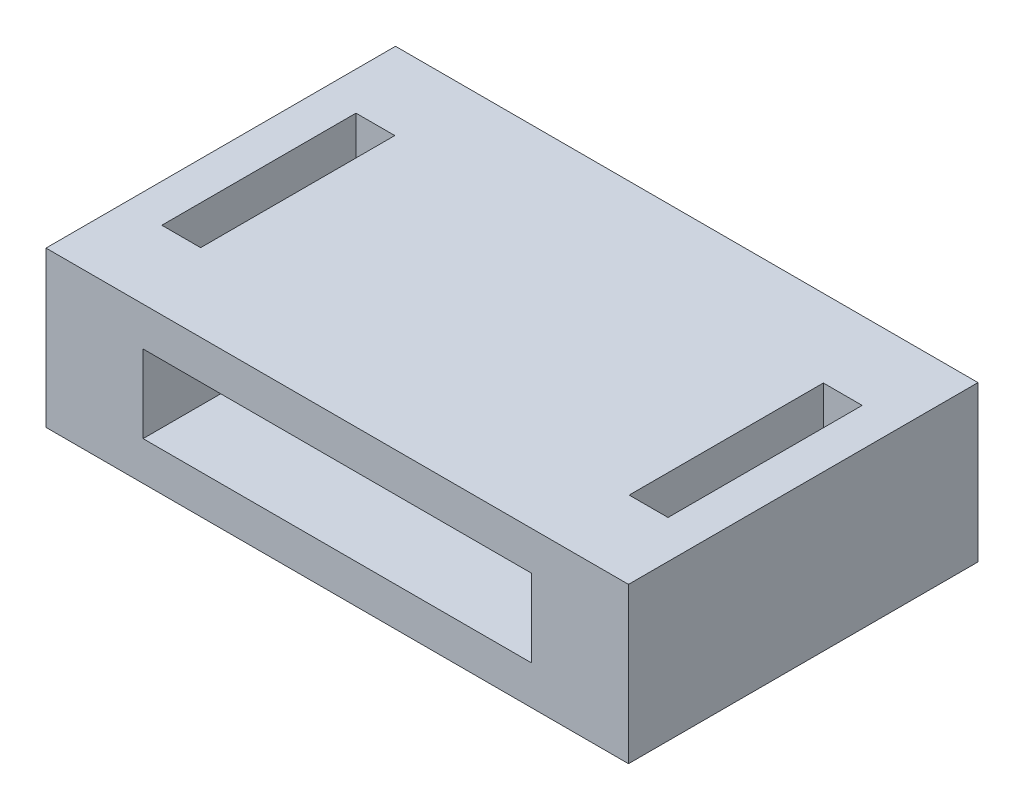
ISO-10303-21;
HEADER;
FILE_DESCRIPTION(('STEP AP214'),'2;1');
FILE_NAME('part.step','',(''),(''),'','','');
FILE_SCHEMA(('AUTOMOTIVE_DESIGN { 1 0 10303 214 1 1 1 1 }'));
ENDSEC;
DATA;
#1=APPLICATION_CONTEXT('core data for automotive mechanical design processes');
#2=APPLICATION_PROTOCOL_DEFINITION('international standard','automotive_design',2000,#1);
#3=PRODUCT_CONTEXT('',#1,'mechanical');
#4=PRODUCT('Part','Part','',(#3));
#5=PRODUCT_RELATED_PRODUCT_CATEGORY('part','',(#4));
#6=PRODUCT_DEFINITION_FORMATION('','',#4);
#7=PRODUCT_DEFINITION_CONTEXT('part definition',#1,'design');
#8=PRODUCT_DEFINITION('design','',#6,#7);
#9=PRODUCT_DEFINITION_SHAPE('','',#8);
#10=(LENGTH_UNIT() NAMED_UNIT(*) SI_UNIT(.MILLI.,.METRE.));
#11=(NAMED_UNIT(*) PLANE_ANGLE_UNIT() SI_UNIT($,.RADIAN.));
#12=(NAMED_UNIT(*) SI_UNIT($,.STERADIAN.) SOLID_ANGLE_UNIT());
#13=UNCERTAINTY_MEASURE_WITH_UNIT(LENGTH_MEASURE(1.E-05),#10,'distance_accuracy_value','');
#14=(GEOMETRIC_REPRESENTATION_CONTEXT(3) GLOBAL_UNCERTAINTY_ASSIGNED_CONTEXT((#13)) GLOBAL_UNIT_ASSIGNED_CONTEXT((#10,
#11,#12)) REPRESENTATION_CONTEXT('',''));
#15=CARTESIAN_POINT('',(0.,0.,0.));
#16=DIRECTION('',(0.,0.,1.));
#17=DIRECTION('',(1.,0.,0.));
#18=AXIS2_PLACEMENT_3D('',#15,#16,#17);
#19=CARTESIAN_POINT('',(0.,2.54,0.));
#20=DIRECTION('',(0.,-1.,0.));
#21=DIRECTION('',(0.,0.,-1.));
#22=AXIS2_PLACEMENT_3D('',#19,#20,#21);
#23=PLANE('',#22);
#24=CARTESIAN_POINT('',(-5.31894104825574,2.54,-2.54));
#25=DIRECTION('',(0.,-1.,0.));
#26=DIRECTION('',(0.,0.,-1.));
#27=AXIS2_PLACEMENT_3D('',#24,#25,#26);
#28=CIRCLE('',#27,1.016);
#29=CARTESIAN_POINT('',(-5.31894104825574,2.54,-3.556));
#30=VERTEX_POINT('',#29);
#31=EDGE_CURVE('E41',#30,#30,#28,.F.);
#32=ORIENTED_EDGE('',*,*,#31,.F.);
#33=EDGE_LOOP('',(#32));
#34=FACE_BOUND('',#33,.T.);
#35=CARTESIAN_POINT('',(5.31894104825574,2.54,-2.54));
#36=DIRECTION('',(0.,-1.,0.));
#37=DIRECTION('',(0.,0.,-1.));
#38=AXIS2_PLACEMENT_3D('',#35,#36,#37);
#39=CIRCLE('',#38,1.016);
#40=CARTESIAN_POINT('',(5.31894104825574,2.54,-3.556));
#41=VERTEX_POINT('',#40);
#42=EDGE_CURVE('E11',#41,#41,#39,.F.);
#43=ORIENTED_EDGE('',*,*,#42,.F.);
#44=EDGE_LOOP('',(#43));
#45=FACE_BOUND('',#44,.T.);
#46=DIRECTION('',(0.,0.,-1.));
#47=VECTOR('',#46,1.);
#48=CARTESIAN_POINT('',(-12.7,2.54,11.43));
#49=LINE('',#48,#47);
#50=CARTESIAN_POINT('',(-12.7,2.54,11.43));
#51=VERTEX_POINT('',#50);
#52=CARTESIAN_POINT('',(-12.7,2.54,-6.35));
#53=VERTEX_POINT('',#52);
#54=EDGE_CURVE('E199',#51,#53,#49,.T.);
#55=ORIENTED_EDGE('',*,*,#54,.F.);
#56=DIRECTION('',(1.,0.,0.));
#57=VECTOR('',#56,1.);
#58=CARTESIAN_POINT('',(-19.05,2.54,11.43));
#59=LINE('',#58,#57);
#60=CARTESIAN_POINT('',(12.7,2.54,11.43));
#61=VERTEX_POINT('',#60);
#62=EDGE_CURVE('E267',#51,#61,#59,.T.);
#63=ORIENTED_EDGE('',*,*,#62,.T.);
#64=DIRECTION('',(0.,0.,1.));
#65=VECTOR('',#64,1.);
#66=CARTESIAN_POINT('',(12.7,2.54,11.43));
#67=LINE('',#66,#65);
#68=CARTESIAN_POINT('',(12.7,2.54,-6.35));
#69=VERTEX_POINT('',#68);
#70=EDGE_CURVE('E53',#69,#61,#67,.T.);
#71=ORIENTED_EDGE('',*,*,#70,.F.);
#72=DIRECTION('',(1.,0.,0.));
#73=VECTOR('',#72,1.);
#74=CARTESIAN_POINT('',(-12.7,2.54,-6.35));
#75=LINE('',#74,#73);
#76=EDGE_CURVE('E48',#53,#69,#75,.T.);
#77=ORIENTED_EDGE('',*,*,#76,.F.);
#78=EDGE_LOOP('',(#55,#63,#71,#77));
#79=FACE_BOUND('',#78,.T.);
#80=ADVANCED_FACE('F33',(#34,#45,#79),#23,.F.);
#81=CARTESIAN_POINT('',(0.,0.,0.));
#82=DIRECTION('',(0.,-1.,0.));
#83=DIRECTION('',(0.,0.,-1.));
#84=AXIS2_PLACEMENT_3D('',#81,#82,#83);
#85=PLANE('',#84);
#86=DIRECTION('',(0.,0.,-1.));
#87=VECTOR('',#86,1.);
#88=CARTESIAN_POINT('',(19.05,0.,11.43));
#89=LINE('',#88,#87);
#90=CARTESIAN_POINT('',(19.05,0.,11.43));
#91=VERTEX_POINT('',#90);
#92=CARTESIAN_POINT('',(19.05,0.,-11.43));
#93=VERTEX_POINT('',#92);
#94=EDGE_CURVE('E266',#91,#93,#89,.T.);
#95=ORIENTED_EDGE('',*,*,#94,.F.);
#96=DIRECTION('',(1.,0.,0.));
#97=VECTOR('',#96,1.);
#98=CARTESIAN_POINT('',(-19.05,0.,11.43));
#99=LINE('',#98,#97);
#100=CARTESIAN_POINT('',(-19.05,0.,11.43));
#101=VERTEX_POINT('',#100);
#102=EDGE_CURVE('E270',#101,#91,#99,.T.);
#103=ORIENTED_EDGE('',*,*,#102,.F.);
#104=DIRECTION('',(0.,0.,1.));
#105=VECTOR('',#104,1.);
#106=CARTESIAN_POINT('',(-19.05,0.,11.43));
#107=LINE('',#106,#105);
#108=CARTESIAN_POINT('',(-19.05,0.,-11.43));
#109=VERTEX_POINT('',#108);
#110=EDGE_CURVE('E275',#109,#101,#107,.T.);
#111=ORIENTED_EDGE('',*,*,#110,.F.);
#112=DIRECTION('',(-1.,0.,0.));
#113=VECTOR('',#112,1.);
#114=CARTESIAN_POINT('',(-19.05,0.,-11.43));
#115=LINE('',#114,#113);
#116=EDGE_CURVE('E273',#93,#109,#115,.T.);
#117=ORIENTED_EDGE('',*,*,#116,.F.);
#118=EDGE_LOOP('',(#95,#103,#111,#117));
#119=FACE_BOUND('',#118,.T.);
#120=DIRECTION('',(-1.,0.,0.));
#121=VECTOR('',#120,1.);
#122=CARTESIAN_POINT('',(-14.014898989899,0.,-6.35));
#123=LINE('',#122,#121);
#124=CARTESIAN_POINT('',(-14.014898989899,0.,-6.35));
#125=VERTEX_POINT('',#124);
#126=CARTESIAN_POINT('',(-16.554898989899,0.,-6.35));
#127=VERTEX_POINT('',#126);
#128=EDGE_CURVE('E253',#125,#127,#123,.T.);
#129=ORIENTED_EDGE('',*,*,#128,.T.);
#130=DIRECTION('',(0.,0.,1.));
#131=VECTOR('',#130,1.);
#132=CARTESIAN_POINT('',(-16.554898989899,0.,6.35));
#133=LINE('',#132,#131);
#134=CARTESIAN_POINT('',(-16.554898989899,0.,6.35));
#135=VERTEX_POINT('',#134);
#136=EDGE_CURVE('E154',#127,#135,#133,.T.);
#137=ORIENTED_EDGE('',*,*,#136,.T.);
#138=DIRECTION('',(1.,0.,0.));
#139=VECTOR('',#138,1.);
#140=CARTESIAN_POINT('',(-14.014898989899,0.,6.35));
#141=LINE('',#140,#139);
#142=CARTESIAN_POINT('',(-14.014898989899,0.,6.35));
#143=VERTEX_POINT('',#142);
#144=EDGE_CURVE('E247',#135,#143,#141,.T.);
#145=ORIENTED_EDGE('',*,*,#144,.T.);
#146=DIRECTION('',(0.,0.,-1.));
#147=VECTOR('',#146,1.);
#148=CARTESIAN_POINT('',(-14.014898989899,0.,6.35));
#149=LINE('',#148,#147);
#150=EDGE_CURVE('E250',#143,#125,#149,.T.);
#151=ORIENTED_EDGE('',*,*,#150,.T.);
#152=EDGE_LOOP('',(#129,#137,#145,#151));
#153=FACE_BOUND('',#152,.T.);
#154=DIRECTION('',(-1.,0.,0.));
#155=VECTOR('',#154,1.);
#156=CARTESIAN_POINT('',(14.014898989899,0.,-6.35));
#157=LINE('',#156,#155);
#158=CARTESIAN_POINT('',(16.554898989899,0.,-6.35));
#159=VERTEX_POINT('',#158);
#160=CARTESIAN_POINT('',(14.014898989899,0.,-6.35));
#161=VERTEX_POINT('',#160);
#162=EDGE_CURVE('E238',#159,#161,#157,.T.);
#163=ORIENTED_EDGE('',*,*,#162,.T.);
#164=DIRECTION('',(0.,0.,1.));
#165=VECTOR('',#164,1.);
#166=CARTESIAN_POINT('',(14.014898989899,0.,6.35));
#167=LINE('',#166,#165);
#168=CARTESIAN_POINT('',(14.014898989899,0.,6.35));
#169=VERTEX_POINT('',#168);
#170=EDGE_CURVE('E232',#161,#169,#167,.T.);
#171=ORIENTED_EDGE('',*,*,#170,.T.);
#172=DIRECTION('',(1.,0.,0.));
#173=VECTOR('',#172,1.);
#174=CARTESIAN_POINT('',(14.014898989899,0.,6.35));
#175=LINE('',#174,#173);
#176=CARTESIAN_POINT('',(16.554898989899,0.,6.35));
#177=VERTEX_POINT('',#176);
#178=EDGE_CURVE('E151',#169,#177,#175,.T.);
#179=ORIENTED_EDGE('',*,*,#178,.T.);
#180=DIRECTION('',(0.,0.,-1.));
#181=VECTOR('',#180,1.);
#182=CARTESIAN_POINT('',(16.554898989899,0.,6.35));
#183=LINE('',#182,#181);
#184=EDGE_CURVE('E235',#177,#159,#183,.T.);
#185=ORIENTED_EDGE('',*,*,#184,.T.);
#186=EDGE_LOOP('',(#163,#171,#179,#185));
#187=FACE_BOUND('',#186,.T.);
#188=ADVANCED_FACE('F295',(#119,#153,#187),#85,.T.);
#189=CARTESIAN_POINT('',(19.05,2.54,11.43));
#190=DIRECTION('',(-1.,0.,0.));
#191=DIRECTION('',(0.,0.,1.));
#192=AXIS2_PLACEMENT_3D('',#189,#190,#191);
#193=PLANE('',#192);
#194=ORIENTED_EDGE('',*,*,#94,.T.);
#195=DIRECTION('',(0.,-1.,0.));
#196=VECTOR('',#195,1.);
#197=CARTESIAN_POINT('',(19.05,2.54,-11.43));
#198=LINE('',#197,#196);
#199=CARTESIAN_POINT('',(19.05,10.16,-11.43));
#200=VERTEX_POINT('',#199);
#201=EDGE_CURVE('E286',#200,#93,#198,.T.);
#202=ORIENTED_EDGE('',*,*,#201,.F.);
#203=DIRECTION('',(0.,0.,-1.));
#204=VECTOR('',#203,1.);
#205=CARTESIAN_POINT('',(19.05,10.16,-11.43));
#206=LINE('',#205,#204);
#207=CARTESIAN_POINT('',(19.05,10.16,11.43));
#208=VERTEX_POINT('',#207);
#209=EDGE_CURVE('E193',#208,#200,#206,.T.);
#210=ORIENTED_EDGE('',*,*,#209,.F.);
#211=DIRECTION('',(0.,-1.,0.));
#212=VECTOR('',#211,1.);
#213=CARTESIAN_POINT('',(19.05,2.54,11.43));
#214=LINE('',#213,#212);
#215=EDGE_CURVE('E269',#208,#91,#214,.T.);
#216=ORIENTED_EDGE('',*,*,#215,.T.);
#217=EDGE_LOOP('',(#194,#202,#210,#216));
#218=FACE_BOUND('',#217,.T.);
#219=ADVANCED_FACE('F35',(#218),#193,.F.);
#220=CARTESIAN_POINT('',(-19.05,2.54,-11.43));
#221=DIRECTION('',(0.,0.,1.));
#222=DIRECTION('',(1.,0.,0.));
#223=AXIS2_PLACEMENT_3D('',#220,#221,#222);
#224=PLANE('',#223);
#225=ORIENTED_EDGE('',*,*,#116,.T.);
#226=DIRECTION('',(0.,-1.,0.));
#227=VECTOR('',#226,1.);
#228=CARTESIAN_POINT('',(-19.05,2.54,-11.43));
#229=LINE('',#228,#227);
#230=CARTESIAN_POINT('',(-19.05,10.16,-11.43));
#231=VERTEX_POINT('',#230);
#232=EDGE_CURVE('E283',#231,#109,#229,.T.);
#233=ORIENTED_EDGE('',*,*,#232,.F.);
#234=DIRECTION('',(-1.,0.,0.));
#235=VECTOR('',#234,1.);
#236=CARTESIAN_POINT('',(-19.05,10.16,-11.43));
#237=LINE('',#236,#235);
#238=EDGE_CURVE('E196',#200,#231,#237,.T.);
#239=ORIENTED_EDGE('',*,*,#238,.F.);
#240=ORIENTED_EDGE('',*,*,#201,.T.);
#241=EDGE_LOOP('',(#225,#233,#239,#240));
#242=FACE_BOUND('',#241,.T.);
#243=ADVANCED_FACE('F367',(#242),#224,.F.);
#244=CARTESIAN_POINT('',(-19.05,2.54,11.43));
#245=DIRECTION('',(1.,0.,0.));
#246=DIRECTION('',(0.,0.,-1.));
#247=AXIS2_PLACEMENT_3D('',#244,#245,#246);
#248=PLANE('',#247);
#249=ORIENTED_EDGE('',*,*,#110,.T.);
#250=DIRECTION('',(0.,-1.,0.));
#251=VECTOR('',#250,1.);
#252=CARTESIAN_POINT('',(-19.05,2.54,11.43));
#253=LINE('',#252,#251);
#254=CARTESIAN_POINT('',(-19.05,10.16,11.43));
#255=VERTEX_POINT('',#254);
#256=EDGE_CURVE('E280',#255,#101,#253,.T.);
#257=ORIENTED_EDGE('',*,*,#256,.F.);
#258=DIRECTION('',(0.,0.,1.));
#259=VECTOR('',#258,1.);
#260=CARTESIAN_POINT('',(-19.05,10.16,-11.43));
#261=LINE('',#260,#259);
#262=EDGE_CURVE('E187',#231,#255,#261,.T.);
#263=ORIENTED_EDGE('',*,*,#262,.F.);
#264=ORIENTED_EDGE('',*,*,#232,.T.);
#265=EDGE_LOOP('',(#249,#257,#263,#264));
#266=FACE_BOUND('',#265,.T.);
#267=ADVANCED_FACE('F365',(#266),#248,.F.);
#268=CARTESIAN_POINT('',(-19.05,2.54,11.43));
#269=DIRECTION('',(0.,0.,-1.));
#270=DIRECTION('',(-1.,0.,0.));
#271=AXIS2_PLACEMENT_3D('',#268,#269,#270);
#272=PLANE('',#271);
#273=DIRECTION('',(0.,-1.,0.));
#274=VECTOR('',#273,1.);
#275=CARTESIAN_POINT('',(-12.7,7.62,11.43));
#276=LINE('',#275,#274);
#277=CARTESIAN_POINT('',(-12.7,7.62,11.43));
#278=VERTEX_POINT('',#277);
#279=EDGE_CURVE('E223',#278,#51,#276,.T.);
#280=ORIENTED_EDGE('',*,*,#279,.F.);
#281=DIRECTION('',(1.,0.,0.));
#282=VECTOR('',#281,1.);
#283=CARTESIAN_POINT('',(-19.05,7.62,11.43));
#284=LINE('',#283,#282);
#285=CARTESIAN_POINT('',(12.7,7.62,11.43));
#286=VERTEX_POINT('',#285);
#287=EDGE_CURVE('E186',#278,#286,#284,.T.);
#288=ORIENTED_EDGE('',*,*,#287,.T.);
#289=DIRECTION('',(0.,-1.,0.));
#290=VECTOR('',#289,1.);
#291=CARTESIAN_POINT('',(12.7,7.62,11.43));
#292=LINE('',#291,#290);
#293=EDGE_CURVE('E211',#286,#61,#292,.T.);
#294=ORIENTED_EDGE('',*,*,#293,.T.);
#295=ORIENTED_EDGE('',*,*,#62,.F.);
#296=EDGE_LOOP('',(#280,#288,#294,#295));
#297=FACE_BOUND('',#296,.T.);
#298=ORIENTED_EDGE('',*,*,#102,.T.);
#299=ORIENTED_EDGE('',*,*,#215,.F.);
#300=DIRECTION('',(1.,0.,0.));
#301=VECTOR('',#300,1.);
#302=CARTESIAN_POINT('',(-19.05,10.16,11.43));
#303=LINE('',#302,#301);
#304=EDGE_CURVE('E190',#255,#208,#303,.T.);
#305=ORIENTED_EDGE('',*,*,#304,.F.);
#306=ORIENTED_EDGE('',*,*,#256,.T.);
#307=EDGE_LOOP('',(#298,#299,#305,#306));
#308=FACE_BOUND('',#307,.T.);
#309=ADVANCED_FACE('F302',(#297,#308),#272,.F.);
#310=CARTESIAN_POINT('',(-16.554898989899,2.54,6.35));
#311=DIRECTION('',(1.,0.,0.));
#312=DIRECTION('',(0.,0.,-1.));
#313=AXIS2_PLACEMENT_3D('',#310,#311,#312);
#314=PLANE('',#313);
#315=ORIENTED_EDGE('',*,*,#136,.F.);
#316=DIRECTION('',(0.,-1.,0.));
#317=VECTOR('',#316,1.);
#318=CARTESIAN_POINT('',(-16.554898989899,2.54,-6.35));
#319=LINE('',#318,#317);
#320=CARTESIAN_POINT('',(-16.554898989899,10.16,-6.35));
#321=VERTEX_POINT('',#320);
#322=EDGE_CURVE('E256',#321,#127,#319,.T.);
#323=ORIENTED_EDGE('',*,*,#322,.F.);
#324=DIRECTION('',(0.,0.,1.));
#325=VECTOR('',#324,1.);
#326=CARTESIAN_POINT('',(-16.554898989899,10.16,-6.35));
#327=LINE('',#326,#325);
#328=CARTESIAN_POINT('',(-16.554898989899,10.16,6.35));
#329=VERTEX_POINT('',#328);
#330=EDGE_CURVE('E174',#321,#329,#327,.T.);
#331=ORIENTED_EDGE('',*,*,#330,.T.);
#332=DIRECTION('',(0.,-1.,0.));
#333=VECTOR('',#332,1.);
#334=CARTESIAN_POINT('',(-16.554898989899,2.54,6.35));
#335=LINE('',#334,#333);
#336=EDGE_CURVE('E263',#329,#135,#335,.T.);
#337=ORIENTED_EDGE('',*,*,#336,.T.);
#338=EDGE_LOOP('',(#315,#323,#331,#337));
#339=FACE_BOUND('',#338,.T.);
#340=ADVANCED_FACE('F355',(#339),#314,.T.);
#341=CARTESIAN_POINT('',(-14.014898989899,2.54,6.35));
#342=DIRECTION('',(0.,0.,-1.));
#343=DIRECTION('',(-1.,0.,0.));
#344=AXIS2_PLACEMENT_3D('',#341,#342,#343);
#345=PLANE('',#344);
#346=ORIENTED_EDGE('',*,*,#144,.F.);
#347=ORIENTED_EDGE('',*,*,#336,.F.);
#348=DIRECTION('',(1.,0.,0.));
#349=VECTOR('',#348,1.);
#350=CARTESIAN_POINT('',(-16.554898989899,10.16,6.35));
#351=LINE('',#350,#349);
#352=CARTESIAN_POINT('',(-14.014898989899,10.16,6.35));
#353=VERTEX_POINT('',#352);
#354=EDGE_CURVE('E177',#329,#353,#351,.T.);
#355=ORIENTED_EDGE('',*,*,#354,.T.);
#356=DIRECTION('',(0.,-1.,0.));
#357=VECTOR('',#356,1.);
#358=CARTESIAN_POINT('',(-14.014898989899,2.54,6.35));
#359=LINE('',#358,#357);
#360=EDGE_CURVE('E261',#353,#143,#359,.T.);
#361=ORIENTED_EDGE('',*,*,#360,.T.);
#362=EDGE_LOOP('',(#346,#347,#355,#361));
#363=FACE_BOUND('',#362,.T.);
#364=ADVANCED_FACE('F351',(#363),#345,.T.);
#365=CARTESIAN_POINT('',(-14.014898989899,2.54,6.35));
#366=DIRECTION('',(-1.,0.,0.));
#367=DIRECTION('',(0.,0.,1.));
#368=AXIS2_PLACEMENT_3D('',#365,#366,#367);
#369=PLANE('',#368);
#370=ORIENTED_EDGE('',*,*,#150,.F.);
#371=ORIENTED_EDGE('',*,*,#360,.F.);
#372=DIRECTION('',(0.,0.,-1.));
#373=VECTOR('',#372,1.);
#374=CARTESIAN_POINT('',(-14.014898989899,10.16,-6.35));
#375=LINE('',#374,#373);
#376=CARTESIAN_POINT('',(-14.014898989899,10.16,-6.35));
#377=VERTEX_POINT('',#376);
#378=EDGE_CURVE('E180',#353,#377,#375,.T.);
#379=ORIENTED_EDGE('',*,*,#378,.T.);
#380=DIRECTION('',(0.,-1.,0.));
#381=VECTOR('',#380,1.);
#382=CARTESIAN_POINT('',(-14.014898989899,2.54,-6.35));
#383=LINE('',#382,#381);
#384=EDGE_CURVE('E259',#377,#125,#383,.T.);
#385=ORIENTED_EDGE('',*,*,#384,.T.);
#386=EDGE_LOOP('',(#370,#371,#379,#385));
#387=FACE_BOUND('',#386,.T.);
#388=ADVANCED_FACE('F347',(#387),#369,.T.);
#389=CARTESIAN_POINT('',(-14.014898989899,2.54,-6.35));
#390=DIRECTION('',(0.,0.,1.));
#391=DIRECTION('',(1.,0.,0.));
#392=AXIS2_PLACEMENT_3D('',#389,#390,#391);
#393=PLANE('',#392);
#394=ORIENTED_EDGE('',*,*,#128,.F.);
#395=ORIENTED_EDGE('',*,*,#384,.F.);
#396=DIRECTION('',(-1.,0.,0.));
#397=VECTOR('',#396,1.);
#398=CARTESIAN_POINT('',(-16.554898989899,10.16,-6.35));
#399=LINE('',#398,#397);
#400=EDGE_CURVE('E183',#377,#321,#399,.T.);
#401=ORIENTED_EDGE('',*,*,#400,.T.);
#402=ORIENTED_EDGE('',*,*,#322,.T.);
#403=EDGE_LOOP('',(#394,#395,#401,#402));
#404=FACE_BOUND('',#403,.T.);
#405=ADVANCED_FACE('F344',(#404),#393,.T.);
#406=CARTESIAN_POINT('',(14.014898989899,2.54,6.35));
#407=DIRECTION('',(1.,0.,0.));
#408=DIRECTION('',(0.,0.,-1.));
#409=AXIS2_PLACEMENT_3D('',#406,#407,#408);
#410=PLANE('',#409);
#411=ORIENTED_EDGE('',*,*,#170,.F.);
#412=DIRECTION('',(0.,-1.,0.));
#413=VECTOR('',#412,1.);
#414=CARTESIAN_POINT('',(14.014898989899,2.54,-6.35));
#415=LINE('',#414,#413);
#416=CARTESIAN_POINT('',(14.014898989899,10.16,-6.35));
#417=VERTEX_POINT('',#416);
#418=EDGE_CURVE('E161',#417,#161,#415,.T.);
#419=ORIENTED_EDGE('',*,*,#418,.F.);
#420=DIRECTION('',(0.,0.,1.));
#421=VECTOR('',#420,1.);
#422=CARTESIAN_POINT('',(14.014898989899,10.16,-6.35));
#423=LINE('',#422,#421);
#424=CARTESIAN_POINT('',(14.014898989899,10.16,6.35));
#425=VERTEX_POINT('',#424);
#426=EDGE_CURVE('E158',#417,#425,#423,.T.);
#427=ORIENTED_EDGE('',*,*,#426,.T.);
#428=DIRECTION('',(0.,-1.,0.));
#429=VECTOR('',#428,1.);
#430=CARTESIAN_POINT('',(14.014898989899,2.54,6.35));
#431=LINE('',#430,#429);
#432=EDGE_CURVE('E144',#425,#169,#431,.T.);
#433=ORIENTED_EDGE('',*,*,#432,.T.);
#434=EDGE_LOOP('',(#411,#419,#427,#433));
#435=FACE_BOUND('',#434,.T.);
#436=ADVANCED_FACE('F159',(#435),#410,.T.);
#437=CARTESIAN_POINT('',(14.014898989899,2.54,6.35));
#438=DIRECTION('',(0.,0.,-1.));
#439=DIRECTION('',(-1.,0.,0.));
#440=AXIS2_PLACEMENT_3D('',#437,#438,#439);
#441=PLANE('',#440);
#442=ORIENTED_EDGE('',*,*,#178,.F.);
#443=ORIENTED_EDGE('',*,*,#432,.F.);
#444=DIRECTION('',(1.,0.,0.));
#445=VECTOR('',#444,1.);
#446=CARTESIAN_POINT('',(14.014898989899,10.16,6.35));
#447=LINE('',#446,#445);
#448=CARTESIAN_POINT('',(16.554898989899,10.16,6.35));
#449=VERTEX_POINT('',#448);
#450=EDGE_CURVE('E148',#425,#449,#447,.T.);
#451=ORIENTED_EDGE('',*,*,#450,.T.);
#452=DIRECTION('',(0.,-1.,0.));
#453=VECTOR('',#452,1.);
#454=CARTESIAN_POINT('',(16.554898989899,2.54,6.35));
#455=LINE('',#454,#453);
#456=EDGE_CURVE('E155',#449,#177,#455,.T.);
#457=ORIENTED_EDGE('',*,*,#456,.T.);
#458=EDGE_LOOP('',(#442,#443,#451,#457));
#459=FACE_BOUND('',#458,.T.);
#460=ADVANCED_FACE('F146',(#459),#441,.T.);
#461=CARTESIAN_POINT('',(16.554898989899,2.54,6.35));
#462=DIRECTION('',(-1.,0.,0.));
#463=DIRECTION('',(0.,0.,1.));
#464=AXIS2_PLACEMENT_3D('',#461,#462,#463);
#465=PLANE('',#464);
#466=ORIENTED_EDGE('',*,*,#184,.F.);
#467=ORIENTED_EDGE('',*,*,#456,.F.);
#468=DIRECTION('',(0.,0.,-1.));
#469=VECTOR('',#468,1.);
#470=CARTESIAN_POINT('',(16.554898989899,10.16,-6.35));
#471=LINE('',#470,#469);
#472=CARTESIAN_POINT('',(16.554898989899,10.16,-6.35));
#473=VERTEX_POINT('',#472);
#474=EDGE_CURVE('E168',#449,#473,#471,.T.);
#475=ORIENTED_EDGE('',*,*,#474,.T.);
#476=DIRECTION('',(0.,-1.,0.));
#477=VECTOR('',#476,1.);
#478=CARTESIAN_POINT('',(16.554898989899,2.54,-6.35));
#479=LINE('',#478,#477);
#480=EDGE_CURVE('E242',#473,#159,#479,.T.);
#481=ORIENTED_EDGE('',*,*,#480,.T.);
#482=EDGE_LOOP('',(#466,#467,#475,#481));
#483=FACE_BOUND('',#482,.T.);
#484=ADVANCED_FACE('F335',(#483),#465,.T.);
#485=CARTESIAN_POINT('',(14.014898989899,2.54,-6.35));
#486=DIRECTION('',(0.,0.,1.));
#487=DIRECTION('',(1.,0.,0.));
#488=AXIS2_PLACEMENT_3D('',#485,#486,#487);
#489=PLANE('',#488);
#490=ORIENTED_EDGE('',*,*,#162,.F.);
#491=ORIENTED_EDGE('',*,*,#480,.F.);
#492=DIRECTION('',(-1.,0.,0.));
#493=VECTOR('',#492,1.);
#494=CARTESIAN_POINT('',(14.014898989899,10.16,-6.35));
#495=LINE('',#494,#493);
#496=EDGE_CURVE('E170',#473,#417,#495,.T.);
#497=ORIENTED_EDGE('',*,*,#496,.T.);
#498=ORIENTED_EDGE('',*,*,#418,.T.);
#499=EDGE_LOOP('',(#490,#491,#497,#498));
#500=FACE_BOUND('',#499,.T.);
#501=ADVANCED_FACE('F331',(#500),#489,.T.);
#502=CARTESIAN_POINT('',(-5.31894104825574,7.62,-2.54));
#503=DIRECTION('',(0.,-1.,0.));
#504=DIRECTION('',(0.,0.,-1.));
#505=AXIS2_PLACEMENT_3D('',#502,#503,#504);
#506=CYLINDRICAL_SURFACE('',#505,1.016);
#507=CARTESIAN_POINT('',(-5.31894104825574,7.62,-2.54));
#508=DIRECTION('',(0.,1.,0.));
#509=DIRECTION('',(0.,0.,1.));
#510=AXIS2_PLACEMENT_3D('',#507,#508,#509);
#511=CIRCLE('',#510,1.016);
#512=CARTESIAN_POINT('',(-5.31894104825574,7.62,-1.524));
#513=VERTEX_POINT('',#512);
#514=EDGE_CURVE('E229',#513,#513,#511,.T.);
#515=ORIENTED_EDGE('',*,*,#514,.F.);
#516=EDGE_LOOP('',(#515));
#517=FACE_BOUND('',#516,.T.);
#518=ORIENTED_EDGE('',*,*,#31,.T.);
#519=EDGE_LOOP('',(#518));
#520=FACE_BOUND('',#519,.T.);
#521=ADVANCED_FACE('F291',(#517,#520),#506,.T.);
#522=CARTESIAN_POINT('',(5.31894104825574,7.62,-2.54));
#523=DIRECTION('',(0.,-1.,0.));
#524=DIRECTION('',(0.,0.,-1.));
#525=AXIS2_PLACEMENT_3D('',#522,#523,#524);
#526=CYLINDRICAL_SURFACE('',#525,1.016);
#527=CARTESIAN_POINT('',(5.31894104825574,7.62,-2.54));
#528=DIRECTION('',(0.,1.,0.));
#529=DIRECTION('',(0.,0.,-1.));
#530=AXIS2_PLACEMENT_3D('',#527,#528,#529);
#531=CIRCLE('',#530,1.016);
#532=CARTESIAN_POINT('',(5.31894104825574,7.62,-3.556));
#533=VERTEX_POINT('',#532);
#534=EDGE_CURVE('E226',#533,#533,#531,.T.);
#535=ORIENTED_EDGE('',*,*,#534,.F.);
#536=EDGE_LOOP('',(#535));
#537=FACE_BOUND('',#536,.T.);
#538=ORIENTED_EDGE('',*,*,#42,.T.);
#539=EDGE_LOOP('',(#538));
#540=FACE_BOUND('',#539,.T.);
#541=ADVANCED_FACE('F322',(#537,#540),#526,.T.);
#542=CARTESIAN_POINT('',(-12.7,7.62,11.43));
#543=DIRECTION('',(-1.,0.,0.));
#544=DIRECTION('',(0.,0.,1.));
#545=AXIS2_PLACEMENT_3D('',#542,#543,#544);
#546=PLANE('',#545);
#547=ORIENTED_EDGE('',*,*,#54,.T.);
#548=DIRECTION('',(0.,-1.,0.));
#549=VECTOR('',#548,1.);
#550=CARTESIAN_POINT('',(-12.7,7.62,-6.35));
#551=LINE('',#550,#549);
#552=CARTESIAN_POINT('',(-12.7,7.62,-6.35));
#553=VERTEX_POINT('',#552);
#554=EDGE_CURVE('E220',#553,#53,#551,.T.);
#555=ORIENTED_EDGE('',*,*,#554,.F.);
#556=DIRECTION('',(0.,0.,-1.));
#557=VECTOR('',#556,1.);
#558=CARTESIAN_POINT('',(-12.7,7.62,11.43));
#559=LINE('',#558,#557);
#560=EDGE_CURVE('E202',#278,#553,#559,.T.);
#561=ORIENTED_EDGE('',*,*,#560,.F.);
#562=ORIENTED_EDGE('',*,*,#279,.T.);
#563=EDGE_LOOP('',(#547,#555,#561,#562));
#564=FACE_BOUND('',#563,.T.);
#565=ADVANCED_FACE('F305',(#564),#546,.F.);
#566=CARTESIAN_POINT('',(-12.7,7.62,-6.35));
#567=DIRECTION('',(0.,0.,-1.));
#568=DIRECTION('',(-1.,0.,0.));
#569=AXIS2_PLACEMENT_3D('',#566,#567,#568);
#570=PLANE('',#569);
#571=ORIENTED_EDGE('',*,*,#76,.T.);
#572=DIRECTION('',(0.,-1.,0.));
#573=VECTOR('',#572,1.);
#574=CARTESIAN_POINT('',(12.7,7.62,-6.35));
#575=LINE('',#574,#573);
#576=CARTESIAN_POINT('',(12.7,7.62,-6.35));
#577=VERTEX_POINT('',#576);
#578=EDGE_CURVE('E217',#577,#69,#575,.T.);
#579=ORIENTED_EDGE('',*,*,#578,.F.);
#580=DIRECTION('',(1.,0.,0.));
#581=VECTOR('',#580,1.);
#582=CARTESIAN_POINT('',(-12.7,7.62,-6.35));
#583=LINE('',#582,#581);
#584=EDGE_CURVE('E205',#553,#577,#583,.T.);
#585=ORIENTED_EDGE('',*,*,#584,.F.);
#586=ORIENTED_EDGE('',*,*,#554,.T.);
#587=EDGE_LOOP('',(#571,#579,#585,#586));
#588=FACE_BOUND('',#587,.T.);
#589=ADVANCED_FACE('F314',(#588),#570,.F.);
#590=CARTESIAN_POINT('',(12.7,7.62,11.43));
#591=DIRECTION('',(1.,0.,0.));
#592=DIRECTION('',(0.,0.,-1.));
#593=AXIS2_PLACEMENT_3D('',#590,#591,#592);
#594=PLANE('',#593);
#595=ORIENTED_EDGE('',*,*,#70,.T.);
#596=ORIENTED_EDGE('',*,*,#293,.F.);
#597=DIRECTION('',(0.,0.,1.));
#598=VECTOR('',#597,1.);
#599=CARTESIAN_POINT('',(12.7,7.62,11.43));
#600=LINE('',#599,#598);
#601=EDGE_CURVE('E208',#577,#286,#600,.T.);
#602=ORIENTED_EDGE('',*,*,#601,.F.);
#603=ORIENTED_EDGE('',*,*,#578,.T.);
#604=EDGE_LOOP('',(#595,#596,#602,#603));
#605=FACE_BOUND('',#604,.T.);
#606=ADVANCED_FACE('F312',(#605),#594,.F.);
#607=CARTESIAN_POINT('',(0.,7.62,0.));
#608=DIRECTION('',(0.,1.,0.));
#609=DIRECTION('',(0.,0.,1.));
#610=AXIS2_PLACEMENT_3D('',#607,#608,#609);
#611=PLANE('',#610);
#612=ORIENTED_EDGE('',*,*,#534,.T.);
#613=EDGE_LOOP('',(#612));
#614=FACE_BOUND('',#613,.T.);
#615=ORIENTED_EDGE('',*,*,#287,.F.);
#616=ORIENTED_EDGE('',*,*,#560,.T.);
#617=ORIENTED_EDGE('',*,*,#584,.T.);
#618=ORIENTED_EDGE('',*,*,#601,.T.);
#619=EDGE_LOOP('',(#615,#616,#617,#618));
#620=FACE_BOUND('',#619,.T.);
#621=ORIENTED_EDGE('',*,*,#514,.T.);
#622=EDGE_LOOP('',(#621));
#623=FACE_BOUND('',#622,.T.);
#624=ADVANCED_FACE('F308',(#614,#620,#623),#611,.F.);
#625=CARTESIAN_POINT('',(0.,10.16,0.));
#626=DIRECTION('',(0.,1.,0.));
#627=DIRECTION('',(0.,0.,1.));
#628=AXIS2_PLACEMENT_3D('',#625,#626,#627);
#629=PLANE('',#628);
#630=ORIENTED_EDGE('',*,*,#262,.T.);
#631=ORIENTED_EDGE('',*,*,#304,.T.);
#632=ORIENTED_EDGE('',*,*,#209,.T.);
#633=ORIENTED_EDGE('',*,*,#238,.T.);
#634=EDGE_LOOP('',(#630,#631,#632,#633));
#635=FACE_BOUND('',#634,.T.);
#636=ORIENTED_EDGE('',*,*,#354,.F.);
#637=ORIENTED_EDGE('',*,*,#330,.F.);
#638=ORIENTED_EDGE('',*,*,#400,.F.);
#639=ORIENTED_EDGE('',*,*,#378,.F.);
#640=EDGE_LOOP('',(#636,#637,#638,#639));
#641=FACE_BOUND('',#640,.T.);
#642=ORIENTED_EDGE('',*,*,#450,.F.);
#643=ORIENTED_EDGE('',*,*,#426,.F.);
#644=ORIENTED_EDGE('',*,*,#496,.F.);
#645=ORIENTED_EDGE('',*,*,#474,.F.);
#646=EDGE_LOOP('',(#642,#643,#644,#645));
#647=FACE_BOUND('',#646,.T.);
#648=ADVANCED_FACE('F166',(#635,#641,#647),#629,.T.);
#649=CLOSED_SHELL('',(#80,#188,#219,#243,#267,#309,#340,#364,#388,#405,#436,#460,#484,#501,#521,
#541,#565,#589,#606,#624,#648));
#650=MANIFOLD_SOLID_BREP('B2',#649);
#651=ADVANCED_BREP_SHAPE_REPRESENTATION('',(#18,#650),#14);
#652=SHAPE_DEFINITION_REPRESENTATION(#9,#651);
ENDSEC;
END-ISO-10303-21;
